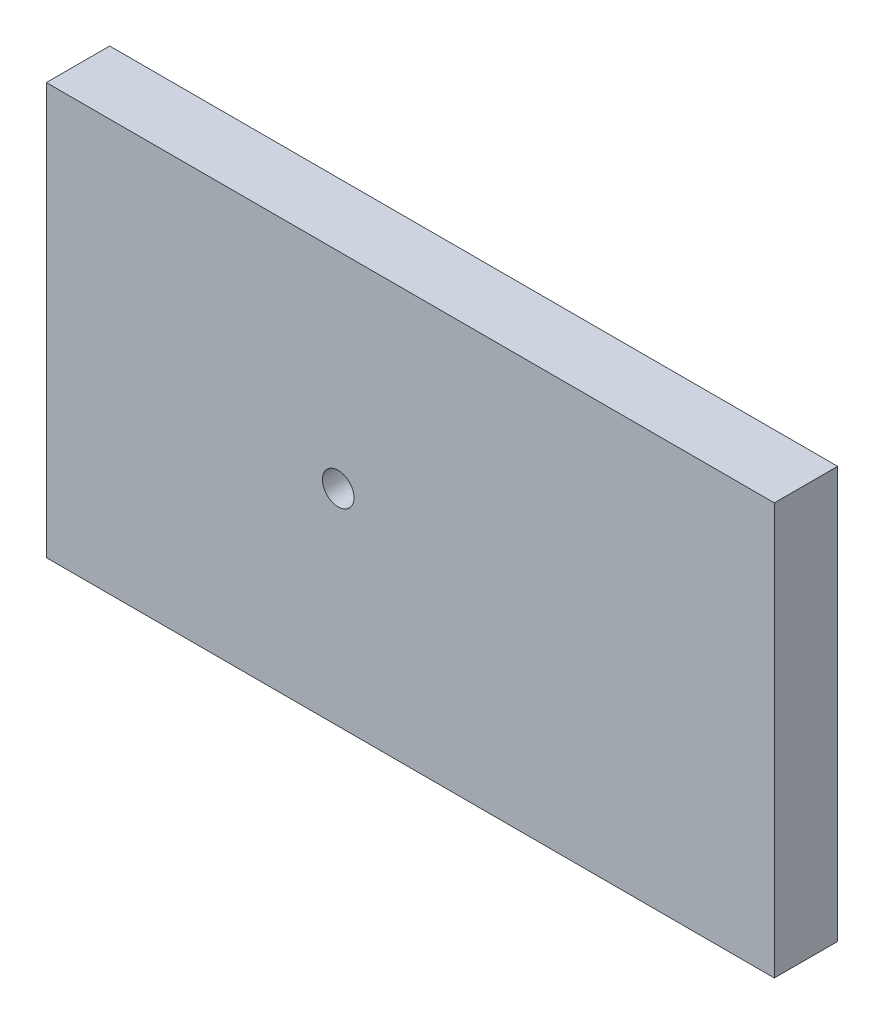
ISO-10303-21;
HEADER;
FILE_DESCRIPTION(('STEP AP214'),'2;1');
FILE_NAME('part.step','',(''),(''),'','','');
FILE_SCHEMA(('AUTOMOTIVE_DESIGN { 1 0 10303 214 1 1 1 1 }'));
ENDSEC;
DATA;
#1=APPLICATION_CONTEXT('core data for automotive mechanical design processes');
#2=APPLICATION_PROTOCOL_DEFINITION('international standard','automotive_design',2000,#1);
#3=PRODUCT_CONTEXT('',#1,'mechanical');
#4=PRODUCT('Part','Part','',(#3));
#5=PRODUCT_RELATED_PRODUCT_CATEGORY('part','',(#4));
#6=PRODUCT_DEFINITION_FORMATION('','',#4);
#7=PRODUCT_DEFINITION_CONTEXT('part definition',#1,'design');
#8=PRODUCT_DEFINITION('design','',#6,#7);
#9=PRODUCT_DEFINITION_SHAPE('','',#8);
#10=(LENGTH_UNIT() NAMED_UNIT(*) SI_UNIT(.MILLI.,.METRE.));
#11=(NAMED_UNIT(*) PLANE_ANGLE_UNIT() SI_UNIT($,.RADIAN.));
#12=(NAMED_UNIT(*) SI_UNIT($,.STERADIAN.) SOLID_ANGLE_UNIT());
#13=UNCERTAINTY_MEASURE_WITH_UNIT(LENGTH_MEASURE(1.E-05),#10,'distance_accuracy_value','');
#14=(GEOMETRIC_REPRESENTATION_CONTEXT(3) GLOBAL_UNCERTAINTY_ASSIGNED_CONTEXT((#13)) GLOBAL_UNIT_ASSIGNED_CONTEXT((#10,
#11,#12)) REPRESENTATION_CONTEXT('',''));
#15=CARTESIAN_POINT('',(0.,0.,0.));
#16=DIRECTION('',(0.,0.,1.));
#17=DIRECTION('',(1.,0.,0.));
#18=AXIS2_PLACEMENT_3D('',#15,#16,#17);
#19=CARTESIAN_POINT('',(0.,0.,12.7));
#20=DIRECTION('',(0.,0.,1.));
#21=DIRECTION('',(1.,0.,0.));
#22=AXIS2_PLACEMENT_3D('',#19,#20,#21);
#23=PLANE('',#22);
#24=DIRECTION('',(0.,1.,0.));
#25=VECTOR('',#24,1.);
#26=CARTESIAN_POINT('',(73.025,41.275,12.7));
#27=LINE('',#26,#25);
#28=CARTESIAN_POINT('',(73.025,-41.275,12.7));
#29=VERTEX_POINT('',#28);
#30=CARTESIAN_POINT('',(73.025,41.275,12.7));
#31=VERTEX_POINT('',#30);
#32=EDGE_CURVE('E86',#29,#31,#27,.T.);
#33=ORIENTED_EDGE('',*,*,#32,.T.);
#34=DIRECTION('',(-1.,0.,0.));
#35=VECTOR('',#34,1.);
#36=CARTESIAN_POINT('',(-73.025,41.275,12.7));
#37=LINE('',#36,#35);
#38=CARTESIAN_POINT('',(-73.025,41.275,12.7));
#39=VERTEX_POINT('',#38);
#40=EDGE_CURVE('E81',#31,#39,#37,.T.);
#41=ORIENTED_EDGE('',*,*,#40,.T.);
#42=DIRECTION('',(0.,-1.,0.));
#43=VECTOR('',#42,1.);
#44=CARTESIAN_POINT('',(-73.025,41.275,12.7));
#45=LINE('',#44,#43);
#46=CARTESIAN_POINT('',(-73.025,-41.275,12.7));
#47=VERTEX_POINT('',#46);
#48=EDGE_CURVE('E84',#39,#47,#45,.T.);
#49=ORIENTED_EDGE('',*,*,#48,.T.);
#50=DIRECTION('',(1.,0.,0.));
#51=VECTOR('',#50,1.);
#52=CARTESIAN_POINT('',(-73.025,-41.275,12.7));
#53=LINE('',#52,#51);
#54=EDGE_CURVE('E51',#47,#29,#53,.T.);
#55=ORIENTED_EDGE('',*,*,#54,.T.);
#56=EDGE_LOOP('',(#33,#41,#49,#55));
#57=FACE_BOUND('',#56,.T.);
#58=CARTESIAN_POINT('',(-14.475000006,0.,12.7));
#59=DIRECTION('',(0.,0.,1.));
#60=DIRECTION('',(1.,0.,0.));
#61=AXIS2_PLACEMENT_3D('',#58,#59,#60);
#62=CIRCLE('',#61,3.175);
#63=CARTESIAN_POINT('',(-11.300000006,0.,12.7));
#64=VERTEX_POINT('',#63);
#65=EDGE_CURVE('E101',#64,#64,#62,.T.);
#66=ORIENTED_EDGE('',*,*,#65,.F.);
#67=EDGE_LOOP('',(#66));
#68=FACE_BOUND('',#67,.T.);
#69=ADVANCED_FACE('F34',(#57,#68),#23,.T.);
#70=CARTESIAN_POINT('',(0.,0.,0.));
#71=DIRECTION('',(0.,0.,1.));
#72=DIRECTION('',(1.,0.,0.));
#73=AXIS2_PLACEMENT_3D('',#70,#71,#72);
#74=PLANE('',#73);
#75=DIRECTION('',(0.,1.,0.));
#76=VECTOR('',#75,1.);
#77=CARTESIAN_POINT('',(73.025,41.275,0.));
#78=LINE('',#77,#76);
#79=CARTESIAN_POINT('',(73.025,-41.275,0.));
#80=VERTEX_POINT('',#79);
#81=CARTESIAN_POINT('',(73.025,41.275,0.));
#82=VERTEX_POINT('',#81);
#83=EDGE_CURVE('E98',#80,#82,#78,.T.);
#84=ORIENTED_EDGE('',*,*,#83,.F.);
#85=DIRECTION('',(1.,0.,0.));
#86=VECTOR('',#85,1.);
#87=CARTESIAN_POINT('',(-73.025,-41.275,0.));
#88=LINE('',#87,#86);
#89=CARTESIAN_POINT('',(-73.025,-41.275,0.));
#90=VERTEX_POINT('',#89);
#91=EDGE_CURVE('E74',#90,#80,#88,.T.);
#92=ORIENTED_EDGE('',*,*,#91,.F.);
#93=DIRECTION('',(0.,-1.,0.));
#94=VECTOR('',#93,1.);
#95=CARTESIAN_POINT('',(-73.025,41.275,0.));
#96=LINE('',#95,#94);
#97=CARTESIAN_POINT('',(-73.025,41.275,0.));
#98=VERTEX_POINT('',#97);
#99=EDGE_CURVE('E68',#98,#90,#96,.T.);
#100=ORIENTED_EDGE('',*,*,#99,.F.);
#101=DIRECTION('',(-1.,0.,0.));
#102=VECTOR('',#101,1.);
#103=CARTESIAN_POINT('',(-73.025,41.275,0.));
#104=LINE('',#103,#102);
#105=EDGE_CURVE('E90',#82,#98,#104,.T.);
#106=ORIENTED_EDGE('',*,*,#105,.F.);
#107=EDGE_LOOP('',(#84,#92,#100,#106));
#108=FACE_BOUND('',#107,.T.);
#109=CARTESIAN_POINT('',(-14.475000006,0.,0.));
#110=DIRECTION('',(0.,0.,1.));
#111=DIRECTION('',(1.,0.,0.));
#112=AXIS2_PLACEMENT_3D('',#109,#110,#111);
#113=CIRCLE('',#112,3.175);
#114=CARTESIAN_POINT('',(-11.300000006,0.,0.));
#115=VERTEX_POINT('',#114);
#116=EDGE_CURVE('E113',#115,#115,#113,.T.);
#117=ORIENTED_EDGE('',*,*,#116,.T.);
#118=EDGE_LOOP('',(#117));
#119=FACE_BOUND('',#118,.T.);
#120=ADVANCED_FACE('F109',(#108,#119),#74,.F.);
#121=CARTESIAN_POINT('',(73.025,41.275,12.7));
#122=DIRECTION('',(-1.,0.,0.));
#123=DIRECTION('',(0.,-1.,0.));
#124=AXIS2_PLACEMENT_3D('',#121,#122,#123);
#125=PLANE('',#124);
#126=ORIENTED_EDGE('',*,*,#83,.T.);
#127=DIRECTION('',(0.,0.,-1.));
#128=VECTOR('',#127,1.);
#129=CARTESIAN_POINT('',(73.025,41.275,12.7));
#130=LINE('',#129,#128);
#131=EDGE_CURVE('E11',#31,#82,#130,.T.);
#132=ORIENTED_EDGE('',*,*,#131,.F.);
#133=ORIENTED_EDGE('',*,*,#32,.F.);
#134=DIRECTION('',(0.,0.,-1.));
#135=VECTOR('',#134,1.);
#136=CARTESIAN_POINT('',(73.025,-41.275,12.7));
#137=LINE('',#136,#135);
#138=EDGE_CURVE('E94',#29,#80,#137,.T.);
#139=ORIENTED_EDGE('',*,*,#138,.T.);
#140=EDGE_LOOP('',(#126,#132,#133,#139));
#141=FACE_BOUND('',#140,.T.);
#142=ADVANCED_FACE('F36',(#141),#125,.F.);
#143=CARTESIAN_POINT('',(-73.025,41.275,12.7));
#144=DIRECTION('',(0.,-1.,0.));
#145=DIRECTION('',(0.,0.,-1.));
#146=AXIS2_PLACEMENT_3D('',#143,#144,#145);
#147=PLANE('',#146);
#148=ORIENTED_EDGE('',*,*,#105,.T.);
#149=DIRECTION('',(0.,0.,-1.));
#150=VECTOR('',#149,1.);
#151=CARTESIAN_POINT('',(-73.025,41.275,12.7));
#152=LINE('',#151,#150);
#153=EDGE_CURVE('E43',#39,#98,#152,.T.);
#154=ORIENTED_EDGE('',*,*,#153,.F.);
#155=ORIENTED_EDGE('',*,*,#40,.F.);
#156=ORIENTED_EDGE('',*,*,#131,.T.);
#157=EDGE_LOOP('',(#148,#154,#155,#156));
#158=FACE_BOUND('',#157,.T.);
#159=ADVANCED_FACE('F89',(#158),#147,.F.);
#160=CARTESIAN_POINT('',(-73.025,41.275,12.7));
#161=DIRECTION('',(1.,0.,0.));
#162=DIRECTION('',(0.,0.,-1.));
#163=AXIS2_PLACEMENT_3D('',#160,#161,#162);
#164=PLANE('',#163);
#165=ORIENTED_EDGE('',*,*,#99,.T.);
#166=DIRECTION('',(0.,0.,-1.));
#167=VECTOR('',#166,1.);
#168=CARTESIAN_POINT('',(-73.025,-41.275,12.7));
#169=LINE('',#168,#167);
#170=EDGE_CURVE('E91',#47,#90,#169,.T.);
#171=ORIENTED_EDGE('',*,*,#170,.F.);
#172=ORIENTED_EDGE('',*,*,#48,.F.);
#173=ORIENTED_EDGE('',*,*,#153,.T.);
#174=EDGE_LOOP('',(#165,#171,#172,#173));
#175=FACE_BOUND('',#174,.T.);
#176=ADVANCED_FACE('F92',(#175),#164,.F.);
#177=CARTESIAN_POINT('',(-73.025,-41.275,12.7));
#178=DIRECTION('',(0.,1.,0.));
#179=DIRECTION('',(0.,0.,1.));
#180=AXIS2_PLACEMENT_3D('',#177,#178,#179);
#181=PLANE('',#180);
#182=ORIENTED_EDGE('',*,*,#91,.T.);
#183=ORIENTED_EDGE('',*,*,#138,.F.);
#184=ORIENTED_EDGE('',*,*,#54,.F.);
#185=ORIENTED_EDGE('',*,*,#170,.T.);
#186=EDGE_LOOP('',(#182,#183,#184,#185));
#187=FACE_BOUND('',#186,.T.);
#188=ADVANCED_FACE('F106',(#187),#181,.F.);
#189=CARTESIAN_POINT('',(-14.475000006,0.,12.7));
#190=DIRECTION('',(0.,0.,-1.));
#191=DIRECTION('',(-1.,0.,0.));
#192=AXIS2_PLACEMENT_3D('',#189,#190,#191);
#193=CYLINDRICAL_SURFACE('',#192,3.175);
#194=ORIENTED_EDGE('',*,*,#65,.T.);
#195=EDGE_LOOP('',(#194));
#196=FACE_BOUND('',#195,.T.);
#197=ORIENTED_EDGE('',*,*,#116,.F.);
#198=EDGE_LOOP('',(#197));
#199=FACE_BOUND('',#198,.T.);
#200=ADVANCED_FACE('F119',(#196,#199),#193,.F.);
#201=CLOSED_SHELL('',(#69,#120,#142,#159,#176,#188,#200));
#202=MANIFOLD_SOLID_BREP('B2',#201);
#203=ADVANCED_BREP_SHAPE_REPRESENTATION('',(#18,#202),#14);
#204=SHAPE_DEFINITION_REPRESENTATION(#9,#203);
ENDSEC;
END-ISO-10303-21;
